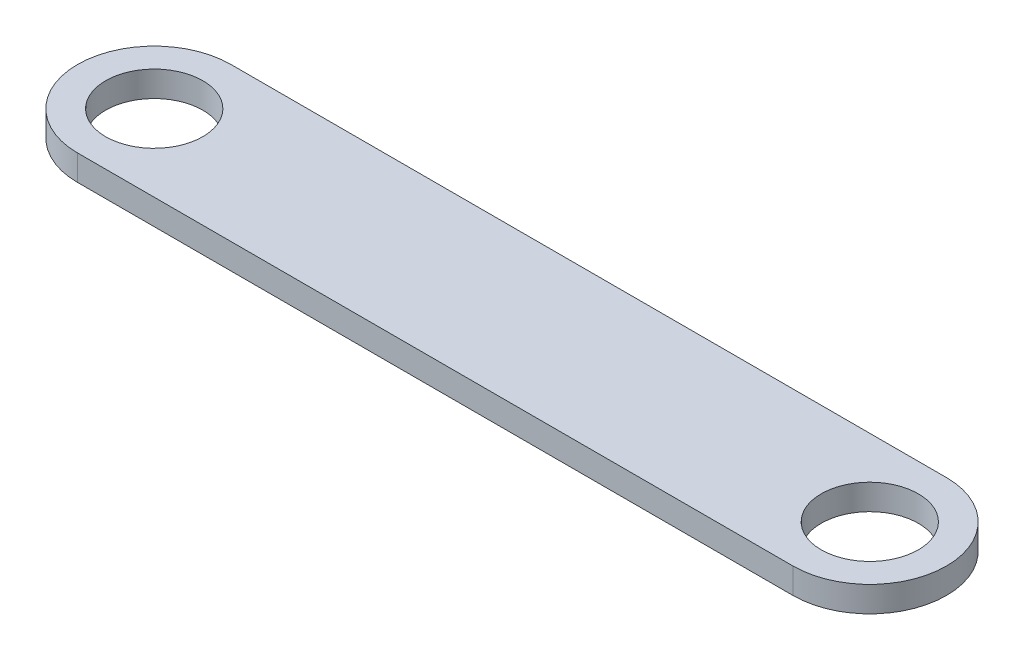
ISO-10303-21;
HEADER;
FILE_DESCRIPTION(('STEP AP214'),'2;1');
FILE_NAME('part.step','',(''),(''),'','','');
FILE_SCHEMA(('AUTOMOTIVE_DESIGN { 1 0 10303 214 1 1 1 1 }'));
ENDSEC;
DATA;
#1=APPLICATION_CONTEXT('core data for automotive mechanical design processes');
#2=APPLICATION_PROTOCOL_DEFINITION('international standard','automotive_design',2000,#1);
#3=PRODUCT_CONTEXT('',#1,'mechanical');
#4=PRODUCT('Part','Part','',(#3));
#5=PRODUCT_RELATED_PRODUCT_CATEGORY('part','',(#4));
#6=PRODUCT_DEFINITION_FORMATION('','',#4);
#7=PRODUCT_DEFINITION_CONTEXT('part definition',#1,'design');
#8=PRODUCT_DEFINITION('design','',#6,#7);
#9=PRODUCT_DEFINITION_SHAPE('','',#8);
#10=(LENGTH_UNIT() NAMED_UNIT(*) SI_UNIT(.MILLI.,.METRE.));
#11=(NAMED_UNIT(*) PLANE_ANGLE_UNIT() SI_UNIT($,.RADIAN.));
#12=(NAMED_UNIT(*) SI_UNIT($,.STERADIAN.) SOLID_ANGLE_UNIT());
#13=UNCERTAINTY_MEASURE_WITH_UNIT(LENGTH_MEASURE(1.E-05),#10,'distance_accuracy_value','');
#14=(GEOMETRIC_REPRESENTATION_CONTEXT(3) GLOBAL_UNCERTAINTY_ASSIGNED_CONTEXT((#13)) GLOBAL_UNIT_ASSIGNED_CONTEXT((#10,
#11,#12)) REPRESENTATION_CONTEXT('',''));
#15=CARTESIAN_POINT('',(0.,0.,0.));
#16=DIRECTION('',(0.,0.,1.));
#17=DIRECTION('',(1.,0.,0.));
#18=AXIS2_PLACEMENT_3D('',#15,#16,#17);
#19=CARTESIAN_POINT('',(-35.,2.5,0.));
#20=DIRECTION('',(0.,-1.,0.));
#21=DIRECTION('',(0.,0.,-1.));
#22=AXIS2_PLACEMENT_3D('',#19,#20,#21);
#23=CYLINDRICAL_SURFACE('',#22,7.5);
#24=CARTESIAN_POINT('',(-35.,0.,0.));
#25=DIRECTION('',(0.,1.,0.));
#26=DIRECTION('',(0.,0.,1.));
#27=AXIS2_PLACEMENT_3D('',#24,#25,#26);
#28=CIRCLE('',#27,7.5);
#29=CARTESIAN_POINT('',(-35.,0.,-7.5));
#30=VERTEX_POINT('',#29);
#31=CARTESIAN_POINT('',(-35.,0.,7.5));
#32=VERTEX_POINT('',#31);
#33=EDGE_CURVE('E107',#30,#32,#28,.T.);
#34=ORIENTED_EDGE('',*,*,#33,.T.);
#35=DIRECTION('',(0.,-1.,0.));
#36=VECTOR('',#35,1.);
#37=CARTESIAN_POINT('',(-35.,2.5,7.5));
#38=LINE('',#37,#36);
#39=CARTESIAN_POINT('',(-35.,2.5,7.5));
#40=VERTEX_POINT('',#39);
#41=EDGE_CURVE('E11',#40,#32,#38,.T.);
#42=ORIENTED_EDGE('',*,*,#41,.F.);
#43=CARTESIAN_POINT('',(-35.,2.5,0.));
#44=DIRECTION('',(0.,1.,0.));
#45=DIRECTION('',(0.,0.,1.));
#46=AXIS2_PLACEMENT_3D('',#43,#44,#45);
#47=CIRCLE('',#46,7.5);
#48=CARTESIAN_POINT('',(-35.,2.5,-7.5));
#49=VERTEX_POINT('',#48);
#50=EDGE_CURVE('E91',#49,#40,#47,.T.);
#51=ORIENTED_EDGE('',*,*,#50,.F.);
#52=DIRECTION('',(0.,-1.,0.));
#53=VECTOR('',#52,1.);
#54=CARTESIAN_POINT('',(-35.,2.5,-7.5));
#55=LINE('',#54,#53);
#56=EDGE_CURVE('E103',#49,#30,#55,.T.);
#57=ORIENTED_EDGE('',*,*,#56,.T.);
#58=EDGE_LOOP('',(#34,#42,#51,#57));
#59=FACE_BOUND('',#58,.T.);
#60=ADVANCED_FACE('F39',(#59),#23,.T.);
#61=CARTESIAN_POINT('',(-35.,2.5,7.5));
#62=DIRECTION('',(0.,0.,-1.));
#63=DIRECTION('',(-1.,0.,0.));
#64=AXIS2_PLACEMENT_3D('',#61,#62,#63);
#65=PLANE('',#64);
#66=DIRECTION('',(1.,0.,0.));
#67=VECTOR('',#66,1.);
#68=CARTESIAN_POINT('',(-35.,0.,7.5));
#69=LINE('',#68,#67);
#70=CARTESIAN_POINT('',(35.,0.,7.49999999999999));
#71=VERTEX_POINT('',#70);
#72=EDGE_CURVE('E96',#32,#71,#69,.T.);
#73=ORIENTED_EDGE('',*,*,#72,.T.);
#74=DIRECTION('',(0.,-1.,0.));
#75=VECTOR('',#74,1.);
#76=CARTESIAN_POINT('',(35.,2.5,7.49999999999999));
#77=LINE('',#76,#75);
#78=CARTESIAN_POINT('',(35.,2.5,7.49999999999999));
#79=VERTEX_POINT('',#78);
#80=EDGE_CURVE('E48',#79,#71,#77,.T.);
#81=ORIENTED_EDGE('',*,*,#80,.F.);
#82=DIRECTION('',(1.,0.,0.));
#83=VECTOR('',#82,1.);
#84=CARTESIAN_POINT('',(-35.,2.5,7.5));
#85=LINE('',#84,#83);
#86=EDGE_CURVE('E86',#40,#79,#85,.T.);
#87=ORIENTED_EDGE('',*,*,#86,.F.);
#88=ORIENTED_EDGE('',*,*,#41,.T.);
#89=EDGE_LOOP('',(#73,#81,#87,#88));
#90=FACE_BOUND('',#89,.T.);
#91=ADVANCED_FACE('F95',(#90),#65,.F.);
#92=CARTESIAN_POINT('',(35.,2.5,0.));
#93=DIRECTION('',(0.,-1.,0.));
#94=DIRECTION('',(0.,0.,-1.));
#95=AXIS2_PLACEMENT_3D('',#92,#93,#94);
#96=CYLINDRICAL_SURFACE('',#95,7.5);
#97=CARTESIAN_POINT('',(35.,0.,0.));
#98=DIRECTION('',(0.,1.,0.));
#99=DIRECTION('',(0.,0.,1.));
#100=AXIS2_PLACEMENT_3D('',#97,#98,#99);
#101=CIRCLE('',#100,7.5);
#102=CARTESIAN_POINT('',(35.,0.,-7.50000000000001));
#103=VERTEX_POINT('',#102);
#104=EDGE_CURVE('E73',#71,#103,#101,.T.);
#105=ORIENTED_EDGE('',*,*,#104,.T.);
#106=DIRECTION('',(0.,-1.,0.));
#107=VECTOR('',#106,1.);
#108=CARTESIAN_POINT('',(35.,2.5,-7.50000000000001));
#109=LINE('',#108,#107);
#110=CARTESIAN_POINT('',(35.,2.5,-7.50000000000001));
#111=VERTEX_POINT('',#110);
#112=EDGE_CURVE('E98',#111,#103,#109,.T.);
#113=ORIENTED_EDGE('',*,*,#112,.F.);
#114=CARTESIAN_POINT('',(35.,2.5,0.));
#115=DIRECTION('',(0.,1.,0.));
#116=DIRECTION('',(0.,0.,1.));
#117=AXIS2_PLACEMENT_3D('',#114,#115,#116);
#118=CIRCLE('',#117,7.5);
#119=EDGE_CURVE('E89',#79,#111,#118,.T.);
#120=ORIENTED_EDGE('',*,*,#119,.F.);
#121=ORIENTED_EDGE('',*,*,#80,.T.);
#122=EDGE_LOOP('',(#105,#113,#120,#121));
#123=FACE_BOUND('',#122,.T.);
#124=ADVANCED_FACE('F99',(#123),#96,.T.);
#125=CARTESIAN_POINT('',(-35.,2.5,-7.5));
#126=DIRECTION('',(0.,0.,1.));
#127=DIRECTION('',(1.,0.,0.));
#128=AXIS2_PLACEMENT_3D('',#125,#126,#127);
#129=PLANE('',#128);
#130=DIRECTION('',(-1.,0.,0.));
#131=VECTOR('',#130,1.);
#132=CARTESIAN_POINT('',(-35.,0.,-7.5));
#133=LINE('',#132,#131);
#134=EDGE_CURVE('E79',#103,#30,#133,.T.);
#135=ORIENTED_EDGE('',*,*,#134,.T.);
#136=ORIENTED_EDGE('',*,*,#56,.F.);
#137=DIRECTION('',(-1.,0.,0.));
#138=VECTOR('',#137,1.);
#139=CARTESIAN_POINT('',(-35.,2.5,-7.5));
#140=LINE('',#139,#138);
#141=EDGE_CURVE('E56',#111,#49,#140,.T.);
#142=ORIENTED_EDGE('',*,*,#141,.F.);
#143=ORIENTED_EDGE('',*,*,#112,.T.);
#144=EDGE_LOOP('',(#135,#136,#142,#143));
#145=FACE_BOUND('',#144,.T.);
#146=ADVANCED_FACE('F121',(#145),#129,.F.);
#147=CARTESIAN_POINT('',(-35.,2.5,0.));
#148=DIRECTION('',(0.,1.,0.));
#149=DIRECTION('',(0.,0.,1.));
#150=AXIS2_PLACEMENT_3D('',#147,#148,#149);
#151=PLANE('',#150);
#152=CARTESIAN_POINT('',(-35.,2.5,0.));
#153=DIRECTION('',(0.,1.,0.));
#154=DIRECTION('',(0.,0.,1.));
#155=AXIS2_PLACEMENT_3D('',#152,#153,#154);
#156=CIRCLE('',#155,4.75);
#157=CARTESIAN_POINT('',(-35.,2.5,4.75));
#158=VERTEX_POINT('',#157);
#159=EDGE_CURVE('E136',#158,#158,#156,.T.);
#160=ORIENTED_EDGE('',*,*,#159,.F.);
#161=EDGE_LOOP('',(#160));
#162=FACE_BOUND('',#161,.T.);
#163=CARTESIAN_POINT('',(35.,2.5,0.));
#164=DIRECTION('',(0.,1.,0.));
#165=DIRECTION('',(0.,0.,1.));
#166=AXIS2_PLACEMENT_3D('',#163,#164,#165);
#167=CIRCLE('',#166,4.75);
#168=CARTESIAN_POINT('',(35.,2.5,4.74999999999998));
#169=VERTEX_POINT('',#168);
#170=EDGE_CURVE('E128',#169,#169,#167,.T.);
#171=ORIENTED_EDGE('',*,*,#170,.F.);
#172=EDGE_LOOP('',(#171));
#173=FACE_BOUND('',#172,.T.);
#174=ORIENTED_EDGE('',*,*,#50,.T.);
#175=ORIENTED_EDGE('',*,*,#86,.T.);
#176=ORIENTED_EDGE('',*,*,#119,.T.);
#177=ORIENTED_EDGE('',*,*,#141,.T.);
#178=EDGE_LOOP('',(#174,#175,#176,#177));
#179=FACE_BOUND('',#178,.T.);
#180=ADVANCED_FACE('F87',(#162,#173,#179),#151,.T.);
#181=CARTESIAN_POINT('',(-35.,0.,0.));
#182=DIRECTION('',(0.,1.,0.));
#183=DIRECTION('',(0.,0.,1.));
#184=AXIS2_PLACEMENT_3D('',#181,#182,#183);
#185=PLANE('',#184);
#186=CARTESIAN_POINT('',(-35.,0.,0.));
#187=DIRECTION('',(0.,1.,0.));
#188=DIRECTION('',(0.,0.,1.));
#189=AXIS2_PLACEMENT_3D('',#186,#187,#188);
#190=CIRCLE('',#189,4.75);
#191=CARTESIAN_POINT('',(-35.,0.,4.75));
#192=VERTEX_POINT('',#191);
#193=EDGE_CURVE('E111',#192,#192,#190,.T.);
#194=ORIENTED_EDGE('',*,*,#193,.T.);
#195=EDGE_LOOP('',(#194));
#196=FACE_BOUND('',#195,.T.);
#197=CARTESIAN_POINT('',(35.,0.,0.));
#198=DIRECTION('',(0.,1.,0.));
#199=DIRECTION('',(0.,0.,1.));
#200=AXIS2_PLACEMENT_3D('',#197,#198,#199);
#201=CIRCLE('',#200,4.75);
#202=CARTESIAN_POINT('',(35.,0.,4.74999999999998));
#203=VERTEX_POINT('',#202);
#204=EDGE_CURVE('E132',#203,#203,#201,.T.);
#205=ORIENTED_EDGE('',*,*,#204,.T.);
#206=EDGE_LOOP('',(#205));
#207=FACE_BOUND('',#206,.T.);
#208=ORIENTED_EDGE('',*,*,#33,.F.);
#209=ORIENTED_EDGE('',*,*,#134,.F.);
#210=ORIENTED_EDGE('',*,*,#104,.F.);
#211=ORIENTED_EDGE('',*,*,#72,.F.);
#212=EDGE_LOOP('',(#208,#209,#210,#211));
#213=FACE_BOUND('',#212,.T.);
#214=ADVANCED_FACE('F124',(#196,#207,#213),#185,.F.);
#215=CARTESIAN_POINT('',(35.,0.,0.));
#216=DIRECTION('',(0.,1.,0.));
#217=DIRECTION('',(0.,0.,1.));
#218=AXIS2_PLACEMENT_3D('',#215,#216,#217);
#219=CYLINDRICAL_SURFACE('',#218,4.75);
#220=ORIENTED_EDGE('',*,*,#204,.F.);
#221=EDGE_LOOP('',(#220));
#222=FACE_BOUND('',#221,.T.);
#223=ORIENTED_EDGE('',*,*,#170,.T.);
#224=EDGE_LOOP('',(#223));
#225=FACE_BOUND('',#224,.T.);
#226=ADVANCED_FACE('F149',(#222,#225),#219,.F.);
#227=CARTESIAN_POINT('',(-35.,0.,0.));
#228=DIRECTION('',(0.,1.,0.));
#229=DIRECTION('',(0.,0.,1.));
#230=AXIS2_PLACEMENT_3D('',#227,#228,#229);
#231=CYLINDRICAL_SURFACE('',#230,4.75);
#232=ORIENTED_EDGE('',*,*,#193,.F.);
#233=EDGE_LOOP('',(#232));
#234=FACE_BOUND('',#233,.T.);
#235=ORIENTED_EDGE('',*,*,#159,.T.);
#236=EDGE_LOOP('',(#235));
#237=FACE_BOUND('',#236,.T.);
#238=ADVANCED_FACE('F146',(#234,#237),#231,.F.);
#239=CLOSED_SHELL('',(#60,#91,#124,#146,#180,#214,#226,#238));
#240=MANIFOLD_SOLID_BREP('B2',#239);
#241=ADVANCED_BREP_SHAPE_REPRESENTATION('',(#18,#240),#14);
#242=SHAPE_DEFINITION_REPRESENTATION(#9,#241);
ENDSEC;
END-ISO-10303-21;
